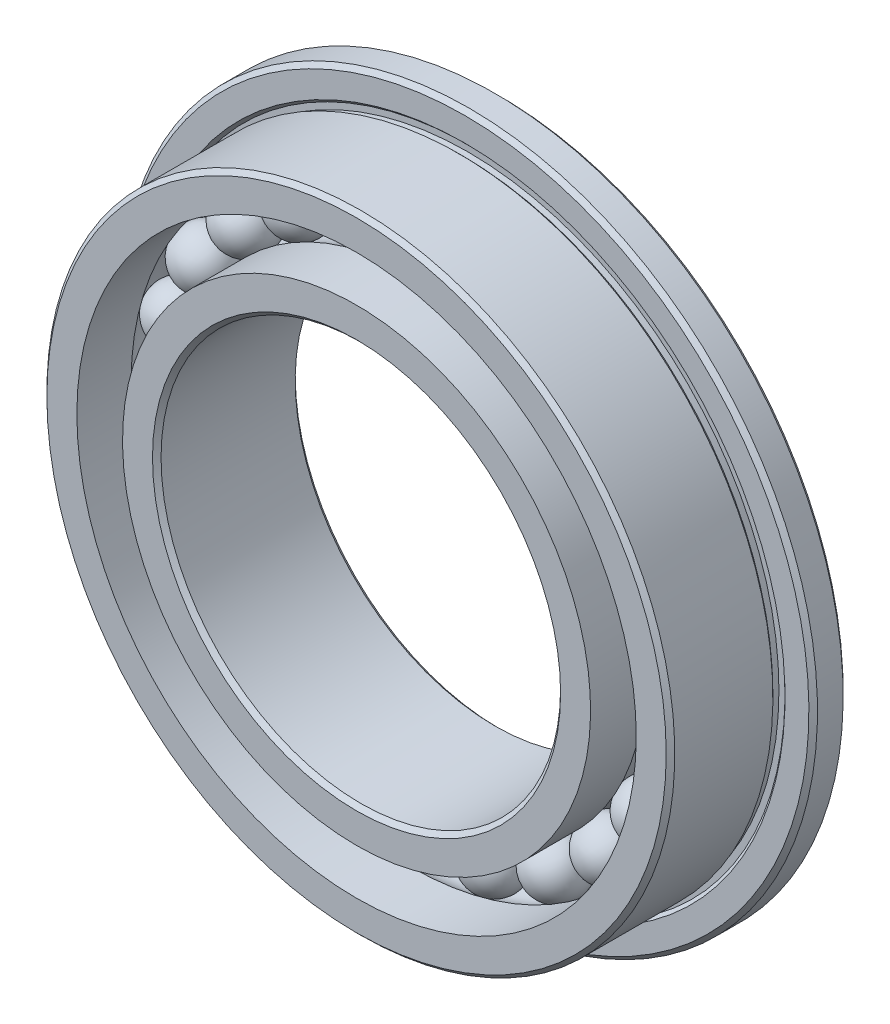
ISO-10303-21;
HEADER;
FILE_DESCRIPTION(('STEP AP214'),'2;1');
FILE_NAME('part.step','',(''),(''),'','','');
FILE_SCHEMA(('AUTOMOTIVE_DESIGN { 1 0 10303 214 1 1 1 1 }'));
ENDSEC;
DATA;
#1=APPLICATION_CONTEXT('core data for automotive mechanical design processes');
#2=APPLICATION_PROTOCOL_DEFINITION('international standard','automotive_design',2000,#1);
#3=PRODUCT_CONTEXT('',#1,'mechanical');
#4=PRODUCT('Part','Part','',(#3));
#5=PRODUCT_RELATED_PRODUCT_CATEGORY('part','',(#4));
#6=PRODUCT_DEFINITION_FORMATION('','',#4);
#7=PRODUCT_DEFINITION_CONTEXT('part definition',#1,'design');
#8=PRODUCT_DEFINITION('design','',#6,#7);
#9=PRODUCT_DEFINITION_SHAPE('','',#8);
#10=(LENGTH_UNIT() NAMED_UNIT(*) SI_UNIT(.MILLI.,.METRE.));
#11=(NAMED_UNIT(*) PLANE_ANGLE_UNIT() SI_UNIT($,.RADIAN.));
#12=(NAMED_UNIT(*) SI_UNIT($,.STERADIAN.) SOLID_ANGLE_UNIT());
#13=UNCERTAINTY_MEASURE_WITH_UNIT(LENGTH_MEASURE(1.E-05),#10,'distance_accuracy_value','');
#14=(GEOMETRIC_REPRESENTATION_CONTEXT(3) GLOBAL_UNCERTAINTY_ASSIGNED_CONTEXT((#13)) GLOBAL_UNIT_ASSIGNED_CONTEXT((#10,
#11,#12)) REPRESENTATION_CONTEXT('',''));
#15=CARTESIAN_POINT('',(0.,0.,0.));
#16=DIRECTION('',(0.,0.,1.));
#17=DIRECTION('',(1.,0.,0.));
#18=AXIS2_PLACEMENT_3D('',#15,#16,#17);
#19=CARTESIAN_POINT('',(-1.16468570296129,4.34666621830082,0.));
#20=DIRECTION('',(-0.258819045102508,0.965925826289072,0.));
#21=DIRECTION('',(0.965925826289072,0.258819045102508,0.));
#22=AXIS2_PLACEMENT_3D('',#19,#20,#21);
#23=SPHERICAL_SURFACE('',#22,0.5);
#24=CARTESIAN_POINT('',(-1.29409522551254,4.82962913144536,0.));
#25=VERTEX_POINT('',#24);
#26=VERTEX_LOOP('',#25);
#27=FACE_BOUND('',#26,.T.);
#28=ADVANCED_FACE('F47',(#27),#23,.T.);
#29=CLOSED_SHELL('',(#28));
#30=MANIFOLD_SOLID_BREP('B2',#29);
#31=CARTESIAN_POINT('',(-2.24999999999995,3.89711431703,0.));
#32=DIRECTION('',(-0.499999999999989,0.866025403784445,0.));
#33=DIRECTION('',(0.866025403784445,0.499999999999989,0.));
#34=AXIS2_PLACEMENT_3D('',#31,#32,#33);
#35=SPHERICAL_SURFACE('',#34,0.5);
#36=CARTESIAN_POINT('',(-2.49999999999994,4.33012701892222,0.));
#37=VERTEX_POINT('',#36);
#38=VERTEX_LOOP('',#37);
#39=FACE_BOUND('',#38,.T.);
#40=ADVANCED_FACE('F67',(#39),#35,.T.);
#41=CLOSED_SHELL('',(#40));
#42=MANIFOLD_SOLID_BREP('B7',#41);
#43=CARTESIAN_POINT('',(-3.18198051533942,3.1819805153395,0.));
#44=DIRECTION('',(-0.707106781186539,0.707106781186556,0.));
#45=DIRECTION('',(0.707106781186556,0.707106781186539,0.));
#46=AXIS2_PLACEMENT_3D('',#43,#44,#45);
#47=SPHERICAL_SURFACE('',#46,0.5);
#48=CARTESIAN_POINT('',(-3.53553390593269,3.53553390593278,0.));
#49=VERTEX_POINT('',#48);
#50=VERTEX_LOOP('',#49);
#51=FACE_BOUND('',#50,.T.);
#52=ADVANCED_FACE('F87',(#51),#47,.T.);
#53=CLOSED_SHELL('',(#52));
#54=MANIFOLD_SOLID_BREP('B43',#53);
#55=CARTESIAN_POINT('',(-3.89711431702995,2.25000000000005,0.));
#56=DIRECTION('',(-0.866025403784433,0.50000000000001,0.));
#57=DIRECTION('',(0.50000000000001,0.866025403784433,0.));
#58=AXIS2_PLACEMENT_3D('',#55,#56,#57);
#59=SPHERICAL_SURFACE('',#58,0.5);
#60=CARTESIAN_POINT('',(-4.33012701892216,2.50000000000005,0.));
#61=VERTEX_POINT('',#60);
#62=VERTEX_LOOP('',#61);
#63=FACE_BOUND('',#62,.T.);
#64=ADVANCED_FACE('F107',(#63),#59,.T.);
#65=CLOSED_SHELL('',(#64));
#66=MANIFOLD_SOLID_BREP('B63',#65);
#67=CARTESIAN_POINT('',(-4.34666621830079,1.16468570296139,0.));
#68=DIRECTION('',(-0.965925826289065,0.258819045102531,0.));
#69=DIRECTION('',(0.258819045102531,0.965925826289065,0.));
#70=AXIS2_PLACEMENT_3D('',#67,#68,#69);
#71=SPHERICAL_SURFACE('',#70,0.5);
#72=CARTESIAN_POINT('',(-4.82962913144533,1.29409522551266,0.));
#73=VERTEX_POINT('',#72);
#74=VERTEX_LOOP('',#73);
#75=FACE_BOUND('',#74,.T.);
#76=ADVANCED_FACE('F127',(#75),#71,.T.);
#77=CLOSED_SHELL('',(#76));
#78=MANIFOLD_SOLID_BREP('B83',#77);
#79=CARTESIAN_POINT('',(-4.5,0.,0.));
#80=DIRECTION('',(-1.,0.,0.));
#81=DIRECTION('',(0.,1.,0.));
#82=AXIS2_PLACEMENT_3D('',#79,#80,#81);
#83=SPHERICAL_SURFACE('',#82,0.5);
#84=CARTESIAN_POINT('',(-5.,0.,0.));
#85=VERTEX_POINT('',#84);
#86=VERTEX_LOOP('',#85);
#87=FACE_BOUND('',#86,.T.);
#88=ADVANCED_FACE('F147',(#87),#83,.T.);
#89=CLOSED_SHELL('',(#88));
#90=MANIFOLD_SOLID_BREP('B103',#89);
#91=CARTESIAN_POINT('',(-4.34666621830082,-1.1646857029613,0.));
#92=DIRECTION('',(-0.965925826289071,-0.258819045102511,0.));
#93=DIRECTION('',(-0.258819045102511,0.965925826289071,0.));
#94=AXIS2_PLACEMENT_3D('',#91,#92,#93);
#95=SPHERICAL_SURFACE('',#94,0.5);
#96=CARTESIAN_POINT('',(-4.82962913144535,-1.29409522551256,0.));
#97=VERTEX_POINT('',#96);
#98=VERTEX_LOOP('',#97);
#99=FACE_BOUND('',#98,.T.);
#100=ADVANCED_FACE('F167',(#99),#95,.T.);
#101=CLOSED_SHELL('',(#100));
#102=MANIFOLD_SOLID_BREP('B123',#101);
#103=CARTESIAN_POINT('',(-3.89711431702999,-2.24999999999996,0.));
#104=DIRECTION('',(-0.866025403784443,-0.499999999999992,0.));
#105=DIRECTION('',(-0.499999999999992,0.866025403784443,0.));
#106=AXIS2_PLACEMENT_3D('',#103,#104,#105);
#107=SPHERICAL_SURFACE('',#106,0.5);
#108=CARTESIAN_POINT('',(-4.33012701892222,-2.49999999999996,0.));
#109=VERTEX_POINT('',#108);
#110=VERTEX_LOOP('',#109);
#111=FACE_BOUND('',#110,.T.);
#112=ADVANCED_FACE('F187',(#111),#107,.T.);
#113=CLOSED_SHELL('',(#112));
#114=MANIFOLD_SOLID_BREP('B143',#113);
#115=CARTESIAN_POINT('',(-3.18198051533949,-3.18198051533944,0.));
#116=DIRECTION('',(-0.707106781186554,-0.707106781186541,0.));
#117=DIRECTION('',(-0.707106781186541,0.707106781186554,0.));
#118=AXIS2_PLACEMENT_3D('',#115,#116,#117);
#119=SPHERICAL_SURFACE('',#118,0.5);
#120=CARTESIAN_POINT('',(-3.53553390593277,-3.53553390593271,0.));
#121=VERTEX_POINT('',#120);
#122=VERTEX_LOOP('',#121);
#123=FACE_BOUND('',#122,.T.);
#124=ADVANCED_FACE('F207',(#123),#119,.T.);
#125=CLOSED_SHELL('',(#124));
#126=MANIFOLD_SOLID_BREP('B163',#125);
#127=CARTESIAN_POINT('',(-2.25000000000003,-3.89711431702996,0.));
#128=DIRECTION('',(-0.500000000000007,-0.866025403784435,0.));
#129=DIRECTION('',(-0.866025403784435,0.500000000000007,0.));
#130=AXIS2_PLACEMENT_3D('',#127,#128,#129);
#131=SPHERICAL_SURFACE('',#130,0.5);
#132=CARTESIAN_POINT('',(-2.50000000000004,-4.33012701892217,0.));
#133=VERTEX_POINT('',#132);
#134=VERTEX_LOOP('',#133);
#135=FACE_BOUND('',#134,.T.);
#136=ADVANCED_FACE('F227',(#135),#131,.T.);
#137=CLOSED_SHELL('',(#136));
#138=MANIFOLD_SOLID_BREP('B183',#137);
#139=CARTESIAN_POINT('',(-1.16468570296138,-4.3466662183008,0.));
#140=DIRECTION('',(-0.258819045102528,-0.965925826289066,0.));
#141=DIRECTION('',(-0.965925826289066,0.258819045102528,0.));
#142=AXIS2_PLACEMENT_3D('',#139,#140,#141);
#143=SPHERICAL_SURFACE('',#142,0.5);
#144=CARTESIAN_POINT('',(-1.29409522551264,-4.82962913144533,0.));
#145=VERTEX_POINT('',#144);
#146=VERTEX_LOOP('',#145);
#147=FACE_BOUND('',#146,.T.);
#148=ADVANCED_FACE('F247',(#147),#143,.T.);
#149=CLOSED_SHELL('',(#148));
#150=MANIFOLD_SOLID_BREP('B203',#149);
#151=CARTESIAN_POINT('',(0.,-4.5,0.));
#152=DIRECTION('',(0.,-1.,0.));
#153=DIRECTION('',(-1.,0.,0.));
#154=AXIS2_PLACEMENT_3D('',#151,#152,#153);
#155=SPHERICAL_SURFACE('',#154,0.5);
#156=CARTESIAN_POINT('',(0.,-5.,0.));
#157=VERTEX_POINT('',#156);
#158=VERTEX_LOOP('',#157);
#159=FACE_BOUND('',#158,.T.);
#160=ADVANCED_FACE('F267',(#159),#155,.T.);
#161=CLOSED_SHELL('',(#160));
#162=MANIFOLD_SOLID_BREP('B223',#161);
#163=CARTESIAN_POINT('',(1.16468570296132,-4.34666621830081,0.));
#164=DIRECTION('',(0.258819045102515,-0.96592582628907,0.));
#165=DIRECTION('',(-0.96592582628907,-0.258819045102515,0.));
#166=AXIS2_PLACEMENT_3D('',#163,#164,#165);
#167=SPHERICAL_SURFACE('',#166,0.5);
#168=CARTESIAN_POINT('',(1.29409522551257,-4.82962913144535,0.));
#169=VERTEX_POINT('',#168);
#170=VERTEX_LOOP('',#169);
#171=FACE_BOUND('',#170,.T.);
#172=ADVANCED_FACE('F287',(#171),#167,.T.);
#173=CLOSED_SHELL('',(#172));
#174=MANIFOLD_SOLID_BREP('B243',#173);
#175=CARTESIAN_POINT('',(2.24999999999998,-3.89711431702999,0.));
#176=DIRECTION('',(0.499999999999995,-0.866025403784441,0.));
#177=DIRECTION('',(-0.866025403784441,-0.499999999999995,0.));
#178=AXIS2_PLACEMENT_3D('',#175,#176,#177);
#179=SPHERICAL_SURFACE('',#178,0.5);
#180=CARTESIAN_POINT('',(2.49999999999997,-4.33012701892221,0.));
#181=VERTEX_POINT('',#180);
#182=VERTEX_LOOP('',#181);
#183=FACE_BOUND('',#182,.T.);
#184=ADVANCED_FACE('F307',(#183),#179,.T.);
#185=CLOSED_SHELL('',(#184));
#186=MANIFOLD_SOLID_BREP('B263',#185);
#187=CARTESIAN_POINT('',(3.18198051533945,-3.18198051533948,0.));
#188=DIRECTION('',(0.707106781186544,-0.707106781186551,0.));
#189=DIRECTION('',(-0.707106781186551,-0.707106781186544,0.));
#190=AXIS2_PLACEMENT_3D('',#187,#188,#189);
#191=SPHERICAL_SURFACE('',#190,0.5);
#192=CARTESIAN_POINT('',(3.53553390593272,-3.53553390593276,0.));
#193=VERTEX_POINT('',#192);
#194=VERTEX_LOOP('',#193);
#195=FACE_BOUND('',#194,.T.);
#196=ADVANCED_FACE('F327',(#195),#191,.T.);
#197=CLOSED_SHELL('',(#196));
#198=MANIFOLD_SOLID_BREP('B283',#197);
#199=CARTESIAN_POINT('',(3.89711431702996,-2.25000000000002,0.));
#200=DIRECTION('',(0.866025403784437,-0.500000000000004,0.));
#201=DIRECTION('',(-0.500000000000004,-0.866025403784437,0.));
#202=AXIS2_PLACEMENT_3D('',#199,#200,#201);
#203=SPHERICAL_SURFACE('',#202,0.5);
#204=CARTESIAN_POINT('',(4.33012701892218,-2.50000000000002,0.));
#205=VERTEX_POINT('',#204);
#206=VERTEX_LOOP('',#205);
#207=FACE_BOUND('',#206,.T.);
#208=ADVANCED_FACE('F347',(#207),#203,.T.);
#209=CLOSED_SHELL('',(#208));
#210=MANIFOLD_SOLID_BREP('B303',#209);
#211=CARTESIAN_POINT('',(4.3466662183008,-1.16468570296136,0.));
#212=DIRECTION('',(0.965925826289067,-0.258819045102525,0.));
#213=DIRECTION('',(-0.258819045102525,-0.965925826289067,0.));
#214=AXIS2_PLACEMENT_3D('',#211,#212,#213);
#215=SPHERICAL_SURFACE('',#214,0.5);
#216=CARTESIAN_POINT('',(4.82962913144534,-1.29409522551262,0.));
#217=VERTEX_POINT('',#216);
#218=VERTEX_LOOP('',#217);
#219=FACE_BOUND('',#218,.T.);
#220=ADVANCED_FACE('F367',(#219),#215,.T.);
#221=CLOSED_SHELL('',(#220));
#222=MANIFOLD_SOLID_BREP('B323',#221);
#223=CARTESIAN_POINT('',(4.5,0.,0.));
#224=DIRECTION('',(1.,0.,0.));
#225=DIRECTION('',(0.,-1.,0.));
#226=AXIS2_PLACEMENT_3D('',#223,#224,#225);
#227=SPHERICAL_SURFACE('',#226,0.5);
#228=CARTESIAN_POINT('',(5.,0.,0.));
#229=VERTEX_POINT('',#228);
#230=VERTEX_LOOP('',#229);
#231=FACE_BOUND('',#230,.T.);
#232=ADVANCED_FACE('F387',(#231),#227,.T.);
#233=CLOSED_SHELL('',(#232));
#234=MANIFOLD_SOLID_BREP('B343',#233);
#235=CARTESIAN_POINT('',(4.34666621830081,1.16468570296133,0.));
#236=DIRECTION('',(0.965925826289069,0.258819045102518,0.));
#237=DIRECTION('',(0.258819045102518,-0.965925826289069,0.));
#238=AXIS2_PLACEMENT_3D('',#235,#236,#237);
#239=SPHERICAL_SURFACE('',#238,0.5);
#240=CARTESIAN_POINT('',(4.82962913144534,1.29409522551259,0.));
#241=VERTEX_POINT('',#240);
#242=VERTEX_LOOP('',#241);
#243=FACE_BOUND('',#242,.T.);
#244=ADVANCED_FACE('F407',(#243),#239,.T.);
#245=CLOSED_SHELL('',(#244));
#246=MANIFOLD_SOLID_BREP('B363',#245);
#247=CARTESIAN_POINT('',(3.89711431702998,2.24999999999999,0.));
#248=DIRECTION('',(0.86602540378444,0.499999999999998,0.));
#249=DIRECTION('',(0.499999999999998,-0.86602540378444,0.));
#250=AXIS2_PLACEMENT_3D('',#247,#248,#249);
#251=SPHERICAL_SURFACE('',#250,0.5);
#252=CARTESIAN_POINT('',(4.3301270189222,2.49999999999999,0.));
#253=VERTEX_POINT('',#252);
#254=VERTEX_LOOP('',#253);
#255=FACE_BOUND('',#254,.T.);
#256=ADVANCED_FACE('F427',(#255),#251,.T.);
#257=CLOSED_SHELL('',(#256));
#258=MANIFOLD_SOLID_BREP('B383',#257);
#259=CARTESIAN_POINT('',(3.18198051533947,3.18198051533946,0.));
#260=DIRECTION('',(0.707106781186549,0.707106781186546,0.));
#261=DIRECTION('',(0.707106781186546,-0.707106781186549,0.));
#262=AXIS2_PLACEMENT_3D('',#259,#260,#261);
#263=SPHERICAL_SURFACE('',#262,0.5);
#264=CARTESIAN_POINT('',(3.53553390593274,3.53553390593273,0.));
#265=VERTEX_POINT('',#264);
#266=VERTEX_LOOP('',#265);
#267=FACE_BOUND('',#266,.T.);
#268=ADVANCED_FACE('F447',(#267),#263,.T.);
#269=CLOSED_SHELL('',(#268));
#270=MANIFOLD_SOLID_BREP('B403',#269);
#271=CARTESIAN_POINT('',(2.25,3.89711431702997,0.));
#272=DIRECTION('',(0.500000000000001,0.866025403784438,0.));
#273=DIRECTION('',(0.866025403784438,-0.500000000000001,0.));
#274=AXIS2_PLACEMENT_3D('',#271,#272,#273);
#275=SPHERICAL_SURFACE('',#274,0.5);
#276=CARTESIAN_POINT('',(2.5,4.33012701892219,0.));
#277=VERTEX_POINT('',#276);
#278=VERTEX_LOOP('',#277);
#279=FACE_BOUND('',#278,.T.);
#280=ADVANCED_FACE('F467',(#279),#275,.T.);
#281=CLOSED_SHELL('',(#280));
#282=MANIFOLD_SOLID_BREP('B423',#281);
#283=CARTESIAN_POINT('',(1.16468570296135,4.34666621830081,0.));
#284=DIRECTION('',(0.258819045102521,0.965925826289068,0.));
#285=DIRECTION('',(0.965925826289068,-0.258819045102521,0.));
#286=AXIS2_PLACEMENT_3D('',#283,#284,#285);
#287=SPHERICAL_SURFACE('',#286,0.5);
#288=CARTESIAN_POINT('',(1.29409522551261,4.82962913144534,0.));
#289=VERTEX_POINT('',#288);
#290=VERTEX_LOOP('',#289);
#291=FACE_BOUND('',#290,.T.);
#292=ADVANCED_FACE('F487',(#291),#287,.T.);
#293=CLOSED_SHELL('',(#292));
#294=MANIFOLD_SOLID_BREP('B443',#293);
#295=CARTESIAN_POINT('',(0.,4.5,0.));
#296=DIRECTION('',(0.,1.,0.));
#297=DIRECTION('',(1.,0.,0.));
#298=AXIS2_PLACEMENT_3D('',#295,#296,#297);
#299=SPHERICAL_SURFACE('',#298,0.5);
#300=CARTESIAN_POINT('',(0.,5.,0.));
#301=VERTEX_POINT('',#300);
#302=VERTEX_LOOP('',#301);
#303=FACE_BOUND('',#302,.T.);
#304=ADVANCED_FACE('F510',(#303),#299,.T.);
#305=CLOSED_SHELL('',(#304));
#306=MANIFOLD_SOLID_BREP('B463',#305);
#307=CARTESIAN_POINT('',(0.,0.,0.));
#308=DIRECTION('',(0.,0.,1.));
#309=DIRECTION('',(0.,-1.,0.));
#310=AXIS2_PLACEMENT_3D('',#307,#308,#309);
#311=CYLINDRICAL_SURFACE('',#310,4.1);
#312=CARTESIAN_POINT('',(0.,0.,-0.299999999999999));
#313=DIRECTION('',(0.,0.,1.));
#314=DIRECTION('',(0.,-1.,0.));
#315=AXIS2_PLACEMENT_3D('',#312,#313,#314);
#316=CIRCLE('',#315,4.1);
#317=CARTESIAN_POINT('',(0.,-4.1,-0.299999999999999));
#318=VERTEX_POINT('',#317);
#319=EDGE_CURVE('E551',#318,#318,#316,.T.);
#320=ORIENTED_EDGE('',*,*,#319,.F.);
#321=EDGE_LOOP('',(#320));
#322=FACE_BOUND('',#321,.T.);
#323=CARTESIAN_POINT('',(0.,0.,-1.25));
#324=DIRECTION('',(0.,0.,1.));
#325=DIRECTION('',(0.,-1.,0.));
#326=AXIS2_PLACEMENT_3D('',#323,#324,#325);
#327=CIRCLE('',#326,4.1);
#328=CARTESIAN_POINT('',(0.,-4.1,-1.25));
#329=VERTEX_POINT('',#328);
#330=EDGE_CURVE('E560',#329,#329,#327,.T.);
#331=ORIENTED_EDGE('',*,*,#330,.T.);
#332=EDGE_LOOP('',(#331));
#333=FACE_BOUND('',#332,.T.);
#334=ADVANCED_FACE('F531',(#322,#333),#311,.T.);
#335=CARTESIAN_POINT('',(0.,0.,0.));
#336=DIRECTION('',(0.,0.,1.));
#337=DIRECTION('',(0.,-1.,0.));
#338=AXIS2_PLACEMENT_3D('',#335,#336,#337);
#339=TOROIDAL_SURFACE('',#338,4.5,0.5);
#340=CARTESIAN_POINT('',(0.,0.,0.299999999999999));
#341=DIRECTION('',(0.,0.,1.));
#342=DIRECTION('',(0.,-1.,0.));
#343=AXIS2_PLACEMENT_3D('',#340,#341,#342);
#344=CIRCLE('',#343,4.1);
#345=CARTESIAN_POINT('',(0.,-4.1,0.299999999999999));
#346=VERTEX_POINT('',#345);
#347=EDGE_CURVE('E554',#346,#346,#344,.T.);
#348=ORIENTED_EDGE('',*,*,#347,.F.);
#349=EDGE_LOOP('',(#348));
#350=FACE_BOUND('',#349,.T.);
#351=ORIENTED_EDGE('',*,*,#319,.T.);
#352=EDGE_LOOP('',(#351));
#353=FACE_BOUND('',#352,.T.);
#354=ADVANCED_FACE('F579',(#350,#353),#339,.F.);
#355=CARTESIAN_POINT('',(0.,0.,0.));
#356=DIRECTION('',(0.,0.,1.));
#357=DIRECTION('',(0.,-1.,0.));
#358=AXIS2_PLACEMENT_3D('',#355,#356,#357);
#359=CYLINDRICAL_SURFACE('',#358,4.1);
#360=CARTESIAN_POINT('',(0.,0.,1.25));
#361=DIRECTION('',(0.,0.,1.));
#362=DIRECTION('',(0.,-1.,0.));
#363=AXIS2_PLACEMENT_3D('',#360,#361,#362);
#364=CIRCLE('',#363,4.1);
#365=CARTESIAN_POINT('',(0.,-4.1,1.25));
#366=VERTEX_POINT('',#365);
#367=EDGE_CURVE('E557',#366,#366,#364,.T.);
#368=ORIENTED_EDGE('',*,*,#367,.F.);
#369=EDGE_LOOP('',(#368));
#370=FACE_BOUND('',#369,.T.);
#371=ORIENTED_EDGE('',*,*,#347,.T.);
#372=EDGE_LOOP('',(#371));
#373=FACE_BOUND('',#372,.T.);
#374=ADVANCED_FACE('F585',(#370,#373),#359,.T.);
#375=CARTESIAN_POINT('',(0.,3.5,1.25));
#376=DIRECTION('',(0.,0.,-1.));
#377=DIRECTION('',(0.,1.,0.));
#378=AXIS2_PLACEMENT_3D('',#375,#376,#377);
#379=PLANE('',#378);
#380=CARTESIAN_POINT('',(0.,0.,1.25));
#381=DIRECTION('',(0.,0.,-1.));
#382=DIRECTION('',(0.,1.,0.));
#383=AXIS2_PLACEMENT_3D('',#380,#381,#382);
#384=CIRCLE('',#383,3.575);
#385=CARTESIAN_POINT('',(0.,3.575,1.25));
#386=VERTEX_POINT('',#385);
#387=EDGE_CURVE('E509',#386,#386,#384,.T.);
#388=ORIENTED_EDGE('',*,*,#387,.T.);
#389=EDGE_LOOP('',(#388));
#390=FACE_BOUND('',#389,.T.);
#391=ORIENTED_EDGE('',*,*,#367,.T.);
#392=EDGE_LOOP('',(#391));
#393=FACE_BOUND('',#392,.T.);
#394=ADVANCED_FACE('F576',(#390,#393),#379,.F.);
#395=CARTESIAN_POINT('',(0.,0.,0.));
#396=DIRECTION('',(0.,0.,1.));
#397=DIRECTION('',(0.,-1.,0.));
#398=AXIS2_PLACEMENT_3D('',#395,#396,#397);
#399=CYLINDRICAL_SURFACE('',#398,3.5);
#400=CARTESIAN_POINT('',(0.,0.,-1.175));
#401=DIRECTION('',(0.,0.,1.));
#402=DIRECTION('',(0.,-1.,0.));
#403=AXIS2_PLACEMENT_3D('',#400,#401,#402);
#404=CIRCLE('',#403,3.5);
#405=CARTESIAN_POINT('',(0.,-3.5,-1.175));
#406=VERTEX_POINT('',#405);
#407=EDGE_CURVE('E538',#406,#406,#404,.F.);
#408=ORIENTED_EDGE('',*,*,#407,.T.);
#409=EDGE_LOOP('',(#408));
#410=FACE_BOUND('',#409,.T.);
#411=CARTESIAN_POINT('',(0.,0.,1.175));
#412=DIRECTION('',(0.,0.,-1.));
#413=DIRECTION('',(0.,1.,0.));
#414=AXIS2_PLACEMENT_3D('',#411,#412,#413);
#415=CIRCLE('',#414,3.5);
#416=CARTESIAN_POINT('',(0.,3.5,1.175));
#417=VERTEX_POINT('',#416);
#418=EDGE_CURVE('E542',#417,#417,#415,.F.);
#419=ORIENTED_EDGE('',*,*,#418,.T.);
#420=EDGE_LOOP('',(#419));
#421=FACE_BOUND('',#420,.T.);
#422=ADVANCED_FACE('F568',(#410,#421),#399,.F.);
#423=CARTESIAN_POINT('',(0.,4.1,-1.25));
#424=DIRECTION('',(0.,0.,1.));
#425=DIRECTION('',(0.,-1.,0.));
#426=AXIS2_PLACEMENT_3D('',#423,#424,#425);
#427=PLANE('',#426);
#428=CARTESIAN_POINT('',(0.,0.,-1.25));
#429=DIRECTION('',(0.,0.,1.));
#430=DIRECTION('',(0.,-1.,0.));
#431=AXIS2_PLACEMENT_3D('',#428,#429,#430);
#432=CIRCLE('',#431,3.575);
#433=CARTESIAN_POINT('',(0.,-3.575,-1.25));
#434=VERTEX_POINT('',#433);
#435=EDGE_CURVE('E546',#434,#434,#432,.T.);
#436=ORIENTED_EDGE('',*,*,#435,.T.);
#437=EDGE_LOOP('',(#436));
#438=FACE_BOUND('',#437,.T.);
#439=ORIENTED_EDGE('',*,*,#330,.F.);
#440=EDGE_LOOP('',(#439));
#441=FACE_BOUND('',#440,.T.);
#442=ADVANCED_FACE('F565',(#438,#441),#427,.F.);
#443=CARTESIAN_POINT('',(0.,0.,-1.25));
#444=DIRECTION('',(0.,0.,-1.));
#445=DIRECTION('',(0.,1.,0.));
#446=AXIS2_PLACEMENT_3D('',#443,#444,#445);
#447=CONICAL_SURFACE('',#446,3.575,0.785398163397448);
#448=ORIENTED_EDGE('',*,*,#407,.F.);
#449=EDGE_LOOP('',(#448));
#450=FACE_BOUND('',#449,.T.);
#451=ORIENTED_EDGE('',*,*,#435,.F.);
#452=EDGE_LOOP('',(#451));
#453=FACE_BOUND('',#452,.T.);
#454=ADVANCED_FACE('F567',(#450,#453),#447,.F.);
#455=CARTESIAN_POINT('',(0.,0.,1.175));
#456=DIRECTION('',(0.,0.,1.));
#457=DIRECTION('',(0.,-1.,0.));
#458=AXIS2_PLACEMENT_3D('',#455,#456,#457);
#459=CONICAL_SURFACE('',#458,3.5,0.785398163397448);
#460=ORIENTED_EDGE('',*,*,#387,.F.);
#461=EDGE_LOOP('',(#460));
#462=FACE_BOUND('',#461,.T.);
#463=ORIENTED_EDGE('',*,*,#418,.F.);
#464=EDGE_LOOP('',(#463));
#465=FACE_BOUND('',#464,.T.);
#466=ADVANCED_FACE('F533',(#462,#465),#459,.F.);
#467=CLOSED_SHELL('',(#334,#354,#374,#394,#422,#442,#454,#466));
#468=MANIFOLD_SOLID_BREP('B483',#467);
#469=CARTESIAN_POINT('',(0.,4.9,-1.25));
#470=DIRECTION('',(0.,0.,1.));
#471=DIRECTION('',(0.,-1.,0.));
#472=AXIS2_PLACEMENT_3D('',#469,#470,#471);
#473=PLANE('',#472);
#474=CARTESIAN_POINT('',(0.,0.,-1.25));
#475=DIRECTION('',(0.,0.,1.));
#476=DIRECTION('',(0.,-1.,0.));
#477=AXIS2_PLACEMENT_3D('',#474,#475,#476);
#478=CIRCLE('',#477,6.025);
#479=CARTESIAN_POINT('',(0.,-6.025,-1.25));
#480=VERTEX_POINT('',#479);
#481=EDGE_CURVE('E668',#480,#480,#478,.F.);
#482=ORIENTED_EDGE('',*,*,#481,.T.);
#483=EDGE_LOOP('',(#482));
#484=FACE_BOUND('',#483,.T.);
#485=CARTESIAN_POINT('',(0.,0.,-1.25));
#486=DIRECTION('',(0.,0.,1.));
#487=DIRECTION('',(0.,-1.,0.));
#488=AXIS2_PLACEMENT_3D('',#485,#486,#487);
#489=CIRCLE('',#488,4.9);
#490=CARTESIAN_POINT('',(0.,-4.9,-1.25));
#491=VERTEX_POINT('',#490);
#492=EDGE_CURVE('E679',#491,#491,#489,.T.);
#493=ORIENTED_EDGE('',*,*,#492,.T.);
#494=EDGE_LOOP('',(#493));
#495=FACE_BOUND('',#494,.T.);
#496=ADVANCED_FACE('F653',(#484,#495),#473,.F.);
#497=CARTESIAN_POINT('',(0.,0.,0.));
#498=DIRECTION('',(0.,0.,1.));
#499=DIRECTION('',(0.,-1.,0.));
#500=AXIS2_PLACEMENT_3D('',#497,#498,#499);
#501=CYLINDRICAL_SURFACE('',#500,4.9);
#502=ORIENTED_EDGE('',*,*,#492,.F.);
#503=EDGE_LOOP('',(#502));
#504=FACE_BOUND('',#503,.T.);
#505=CARTESIAN_POINT('',(0.,0.,-0.299999999999999));
#506=DIRECTION('',(0.,0.,1.));
#507=DIRECTION('',(0.,-1.,0.));
#508=AXIS2_PLACEMENT_3D('',#505,#506,#507);
#509=CIRCLE('',#508,4.9);
#510=CARTESIAN_POINT('',(0.,-4.9,-0.3));
#511=VERTEX_POINT('',#510);
#512=EDGE_CURVE('E682',#511,#511,#509,.T.);
#513=ORIENTED_EDGE('',*,*,#512,.T.);
#514=EDGE_LOOP('',(#513));
#515=FACE_BOUND('',#514,.T.);
#516=ADVANCED_FACE('F725',(#504,#515),#501,.F.);
#517=CARTESIAN_POINT('',(0.,0.,0.));
#518=DIRECTION('',(0.,0.,1.));
#519=DIRECTION('',(0.,-1.,0.));
#520=AXIS2_PLACEMENT_3D('',#517,#518,#519);
#521=TOROIDAL_SURFACE('',#520,4.5,0.5);
#522=ORIENTED_EDGE('',*,*,#512,.F.);
#523=EDGE_LOOP('',(#522));
#524=FACE_BOUND('',#523,.T.);
#525=CARTESIAN_POINT('',(0.,0.,0.299999999999999));
#526=DIRECTION('',(0.,0.,1.));
#527=DIRECTION('',(0.,-1.,0.));
#528=AXIS2_PLACEMENT_3D('',#525,#526,#527);
#529=CIRCLE('',#528,4.9);
#530=CARTESIAN_POINT('',(0.,-4.9,0.299999999999999));
#531=VERTEX_POINT('',#530);
#532=EDGE_CURVE('E685',#531,#531,#529,.T.);
#533=ORIENTED_EDGE('',*,*,#532,.T.);
#534=EDGE_LOOP('',(#533));
#535=FACE_BOUND('',#534,.T.);
#536=ADVANCED_FACE('F731',(#524,#535),#521,.F.);
#537=CARTESIAN_POINT('',(0.,0.,0.));
#538=DIRECTION('',(0.,0.,1.));
#539=DIRECTION('',(0.,-1.,0.));
#540=AXIS2_PLACEMENT_3D('',#537,#538,#539);
#541=CYLINDRICAL_SURFACE('',#540,4.9);
#542=ORIENTED_EDGE('',*,*,#532,.F.);
#543=EDGE_LOOP('',(#542));
#544=FACE_BOUND('',#543,.T.);
#545=CARTESIAN_POINT('',(0.,0.,1.25));
#546=DIRECTION('',(0.,0.,1.));
#547=DIRECTION('',(0.,-1.,0.));
#548=AXIS2_PLACEMENT_3D('',#545,#546,#547);
#549=CIRCLE('',#548,4.9);
#550=CARTESIAN_POINT('',(0.,-4.9,1.25));
#551=VERTEX_POINT('',#550);
#552=EDGE_CURVE('E688',#551,#551,#549,.T.);
#553=ORIENTED_EDGE('',*,*,#552,.T.);
#554=EDGE_LOOP('',(#553));
#555=FACE_BOUND('',#554,.T.);
#556=ADVANCED_FACE('F795',(#544,#555),#541,.F.);
#557=CARTESIAN_POINT('',(0.,5.5,1.25));
#558=DIRECTION('',(0.,0.,-1.));
#559=DIRECTION('',(0.,1.,0.));
#560=AXIS2_PLACEMENT_3D('',#557,#558,#559);
#561=PLANE('',#560);
#562=CARTESIAN_POINT('',(0.,0.,1.25));
#563=DIRECTION('',(0.,0.,-1.));
#564=DIRECTION('',(0.,1.,0.));
#565=AXIS2_PLACEMENT_3D('',#562,#563,#564);
#566=CIRCLE('',#565,5.425);
#567=CARTESIAN_POINT('',(0.,5.425,1.25));
#568=VERTEX_POINT('',#567);
#569=EDGE_CURVE('E660',#568,#568,#566,.F.);
#570=ORIENTED_EDGE('',*,*,#569,.T.);
#571=EDGE_LOOP('',(#570));
#572=FACE_BOUND('',#571,.T.);
#573=ORIENTED_EDGE('',*,*,#552,.F.);
#574=EDGE_LOOP('',(#573));
#575=FACE_BOUND('',#574,.T.);
#576=ADVANCED_FACE('F785',(#572,#575),#561,.F.);
#577=CARTESIAN_POINT('',(0.,0.,0.));
#578=DIRECTION('',(0.,0.,1.));
#579=DIRECTION('',(0.,-1.,0.));
#580=AXIS2_PLACEMENT_3D('',#577,#578,#579);
#581=CYLINDRICAL_SURFACE('',#580,5.5);
#582=CARTESIAN_POINT('',(0.,0.,1.175));
#583=DIRECTION('',(0.,0.,-1.));
#584=DIRECTION('',(0.,1.,0.));
#585=AXIS2_PLACEMENT_3D('',#582,#583,#584);
#586=CIRCLE('',#585,5.5);
#587=CARTESIAN_POINT('',(0.,5.5,1.175));
#588=VERTEX_POINT('',#587);
#589=EDGE_CURVE('E530',#588,#588,#586,.T.);
#590=ORIENTED_EDGE('',*,*,#589,.T.);
#591=EDGE_LOOP('',(#590));
#592=FACE_BOUND('',#591,.T.);
#593=CARTESIAN_POINT('',(0.,0.,-0.543933982822018));
#594=DIRECTION('',(0.,0.,1.));
#595=DIRECTION('',(0.,-1.,0.));
#596=AXIS2_PLACEMENT_3D('',#593,#594,#595);
#597=CIRCLE('',#596,5.5);
#598=CARTESIAN_POINT('',(0.,-5.5,-0.543933982822018));
#599=VERTEX_POINT('',#598);
#600=EDGE_CURVE('E691',#599,#599,#597,.T.);
#601=ORIENTED_EDGE('',*,*,#600,.T.);
#602=EDGE_LOOP('',(#601));
#603=FACE_BOUND('',#602,.T.);
#604=ADVANCED_FACE('F779',(#592,#603),#581,.T.);
#605=CARTESIAN_POINT('',(0.,0.,-0.59696699141101));
#606=DIRECTION('',(0.,0.,1.));
#607=DIRECTION('',(0.,-1.,0.));
#608=AXIS2_PLACEMENT_3D('',#605,#606,#607);
#609=CONICAL_SURFACE('',#608,5.44696699141101,0.785398163397442);
#610=ORIENTED_EDGE('',*,*,#600,.F.);
#611=EDGE_LOOP('',(#610));
#612=FACE_BOUND('',#611,.T.);
#613=CARTESIAN_POINT('',(0.,0.,-0.59696699141101));
#614=DIRECTION('',(0.,0.,1.));
#615=DIRECTION('',(0.,-1.,0.));
#616=AXIS2_PLACEMENT_3D('',#613,#614,#615);
#617=CIRCLE('',#616,5.44696699141101);
#618=CARTESIAN_POINT('',(0.,-5.44696699141101,-0.59696699141101));
#619=VERTEX_POINT('',#618);
#620=EDGE_CURVE('E694',#619,#619,#617,.T.);
#621=ORIENTED_EDGE('',*,*,#620,.T.);
#622=EDGE_LOOP('',(#621));
#623=FACE_BOUND('',#622,.T.);
#624=ADVANCED_FACE('F784',(#612,#623),#609,.T.);
#625=CARTESIAN_POINT('',(0.,0.,0.));
#626=DIRECTION('',(0.,0.,1.));
#627=DIRECTION('',(0.,-1.,0.));
#628=AXIS2_PLACEMENT_3D('',#625,#626,#627);
#629=CYLINDRICAL_SURFACE('',#628,5.44696699141101);
#630=ORIENTED_EDGE('',*,*,#620,.F.);
#631=EDGE_LOOP('',(#630));
#632=FACE_BOUND('',#631,.T.);
#633=CARTESIAN_POINT('',(0.,0.,-0.703033008588992));
#634=DIRECTION('',(0.,0.,1.));
#635=DIRECTION('',(0.,-1.,0.));
#636=AXIS2_PLACEMENT_3D('',#633,#634,#635);
#637=CIRCLE('',#636,5.44696699141101);
#638=CARTESIAN_POINT('',(0.,-5.44696699141101,-0.703033008588993));
#639=VERTEX_POINT('',#638);
#640=EDGE_CURVE('E697',#639,#639,#637,.T.);
#641=ORIENTED_EDGE('',*,*,#640,.T.);
#642=EDGE_LOOP('',(#641));
#643=FACE_BOUND('',#642,.T.);
#644=ADVANCED_FACE('F817',(#632,#643),#629,.T.);
#645=CARTESIAN_POINT('',(0.,5.55303300858899,-0.703033008588992));
#646=DIRECTION('',(0.,0.,-1.));
#647=DIRECTION('',(0.,1.,0.));
#648=AXIS2_PLACEMENT_3D('',#645,#646,#647);
#649=PLANE('',#648);
#650=ORIENTED_EDGE('',*,*,#640,.F.);
#651=EDGE_LOOP('',(#650));
#652=FACE_BOUND('',#651,.T.);
#653=CARTESIAN_POINT('',(0.,0.,-0.703033008588992));
#654=DIRECTION('',(0.,0.,1.));
#655=DIRECTION('',(0.,-1.,0.));
#656=AXIS2_PLACEMENT_3D('',#653,#654,#655);
#657=CIRCLE('',#656,5.55303300858899);
#658=CARTESIAN_POINT('',(0.,-5.55303300858899,-0.703033008588992));
#659=VERTEX_POINT('',#658);
#660=EDGE_CURVE('E700',#659,#659,#657,.T.);
#661=ORIENTED_EDGE('',*,*,#660,.T.);
#662=EDGE_LOOP('',(#661));
#663=FACE_BOUND('',#662,.T.);
#664=ADVANCED_FACE('F721',(#652,#663),#649,.F.);
#665=CARTESIAN_POINT('',(0.,0.,-0.650000000000001));
#666=DIRECTION('',(0.,0.,1.));
#667=DIRECTION('',(0.,-1.,0.));
#668=AXIS2_PLACEMENT_3D('',#665,#666,#667);
#669=CONICAL_SURFACE('',#668,5.60606601717798,0.785398163397436);
#670=ORIENTED_EDGE('',*,*,#660,.F.);
#671=EDGE_LOOP('',(#670));
#672=FACE_BOUND('',#671,.T.);
#673=CARTESIAN_POINT('',(0.,0.,-0.650000000000001));
#674=DIRECTION('',(0.,0.,1.));
#675=DIRECTION('',(0.,-1.,0.));
#676=AXIS2_PLACEMENT_3D('',#673,#674,#675);
#677=CIRCLE('',#676,5.60606601717798);
#678=CARTESIAN_POINT('',(0.,-5.60606601717798,-0.650000000000001));
#679=VERTEX_POINT('',#678);
#680=EDGE_CURVE('E703',#679,#679,#677,.T.);
#681=ORIENTED_EDGE('',*,*,#680,.T.);
#682=EDGE_LOOP('',(#681));
#683=FACE_BOUND('',#682,.T.);
#684=ADVANCED_FACE('F707',(#672,#683),#669,.F.);
#685=CARTESIAN_POINT('',(0.,6.1,-0.650000000000001));
#686=DIRECTION('',(0.,0.,-1.));
#687=DIRECTION('',(0.,1.,0.));
#688=AXIS2_PLACEMENT_3D('',#685,#686,#687);
#689=PLANE('',#688);
#690=CARTESIAN_POINT('',(0.,0.,-0.650000000000001));
#691=DIRECTION('',(0.,0.,-1.));
#692=DIRECTION('',(0.,1.,0.));
#693=AXIS2_PLACEMENT_3D('',#690,#691,#692);
#694=CIRCLE('',#693,6.025);
#695=CARTESIAN_POINT('',(0.,6.025,-0.650000000000001));
#696=VERTEX_POINT('',#695);
#697=EDGE_CURVE('E664',#696,#696,#694,.F.);
#698=ORIENTED_EDGE('',*,*,#697,.T.);
#699=EDGE_LOOP('',(#698));
#700=FACE_BOUND('',#699,.T.);
#701=ORIENTED_EDGE('',*,*,#680,.F.);
#702=EDGE_LOOP('',(#701));
#703=FACE_BOUND('',#702,.T.);
#704=ADVANCED_FACE('F709',(#700,#703),#689,.F.);
#705=CARTESIAN_POINT('',(0.,0.,0.));
#706=DIRECTION('',(0.,0.,1.));
#707=DIRECTION('',(0.,-1.,0.));
#708=AXIS2_PLACEMENT_3D('',#705,#706,#707);
#709=CYLINDRICAL_SURFACE('',#708,6.1);
#710=CARTESIAN_POINT('',(0.,0.,-1.175));
#711=DIRECTION('',(0.,0.,1.));
#712=DIRECTION('',(0.,-1.,0.));
#713=AXIS2_PLACEMENT_3D('',#710,#711,#712);
#714=CIRCLE('',#713,6.1);
#715=CARTESIAN_POINT('',(0.,-6.1,-1.175));
#716=VERTEX_POINT('',#715);
#717=EDGE_CURVE('E673',#716,#716,#714,.T.);
#718=ORIENTED_EDGE('',*,*,#717,.T.);
#719=EDGE_LOOP('',(#718));
#720=FACE_BOUND('',#719,.T.);
#721=CARTESIAN_POINT('',(0.,0.,-0.725000000000001));
#722=DIRECTION('',(0.,0.,-1.));
#723=DIRECTION('',(0.,1.,0.));
#724=AXIS2_PLACEMENT_3D('',#721,#722,#723);
#725=CIRCLE('',#724,6.1);
#726=CARTESIAN_POINT('',(0.,6.1,-0.725000000000001));
#727=VERTEX_POINT('',#726);
#728=EDGE_CURVE('E676',#727,#727,#725,.T.);
#729=ORIENTED_EDGE('',*,*,#728,.T.);
#730=EDGE_LOOP('',(#729));
#731=FACE_BOUND('',#730,.T.);
#732=ADVANCED_FACE('F711',(#720,#731),#709,.T.);
#733=CARTESIAN_POINT('',(0.,0.,-1.175));
#734=DIRECTION('',(0.,0.,1.));
#735=DIRECTION('',(0.,-1.,0.));
#736=AXIS2_PLACEMENT_3D('',#733,#734,#735);
#737=CONICAL_SURFACE('',#736,6.1,0.785398163397451);
#738=ORIENTED_EDGE('',*,*,#481,.F.);
#739=EDGE_LOOP('',(#738));
#740=FACE_BOUND('',#739,.T.);
#741=ORIENTED_EDGE('',*,*,#717,.F.);
#742=EDGE_LOOP('',(#741));
#743=FACE_BOUND('',#742,.T.);
#744=ADVANCED_FACE('F718',(#740,#743),#737,.T.);
#745=CARTESIAN_POINT('',(0.,0.,-0.650000000000001));
#746=DIRECTION('',(0.,0.,-1.));
#747=DIRECTION('',(0.,1.,0.));
#748=AXIS2_PLACEMENT_3D('',#745,#746,#747);
#749=CONICAL_SURFACE('',#748,6.025,0.785398163397451);
#750=ORIENTED_EDGE('',*,*,#728,.F.);
#751=EDGE_LOOP('',(#750));
#752=FACE_BOUND('',#751,.T.);
#753=ORIENTED_EDGE('',*,*,#697,.F.);
#754=EDGE_LOOP('',(#753));
#755=FACE_BOUND('',#754,.T.);
#756=ADVANCED_FACE('F738',(#752,#755),#749,.T.);
#757=CARTESIAN_POINT('',(0.,0.,1.25));
#758=DIRECTION('',(0.,0.,-1.));
#759=DIRECTION('',(0.,1.,0.));
#760=AXIS2_PLACEMENT_3D('',#757,#758,#759);
#761=CONICAL_SURFACE('',#760,5.425,0.785398163397451);
#762=ORIENTED_EDGE('',*,*,#589,.F.);
#763=EDGE_LOOP('',(#762));
#764=FACE_BOUND('',#763,.T.);
#765=ORIENTED_EDGE('',*,*,#569,.F.);
#766=EDGE_LOOP('',(#765));
#767=FACE_BOUND('',#766,.T.);
#768=ADVANCED_FACE('F655',(#764,#767),#761,.T.);
#769=CLOSED_SHELL('',(#496,#516,#536,#556,#576,#604,#624,#644,#664,#684,#704,#732,#744,#756,#768));
#770=MANIFOLD_SOLID_BREP('B504',#769);
#771=ADVANCED_BREP_SHAPE_REPRESENTATION('',(#18,#30,#42,#54,#66,#78,#90,#102,#114,#126,#138,
#150,#162,#174,#186,#198,#210,#222,#234,#246,#258,#270,#282,#294,#306,#468,#770),#14);
#772=SHAPE_DEFINITION_REPRESENTATION(#9,#771);
ENDSEC;
END-ISO-10303-21;
